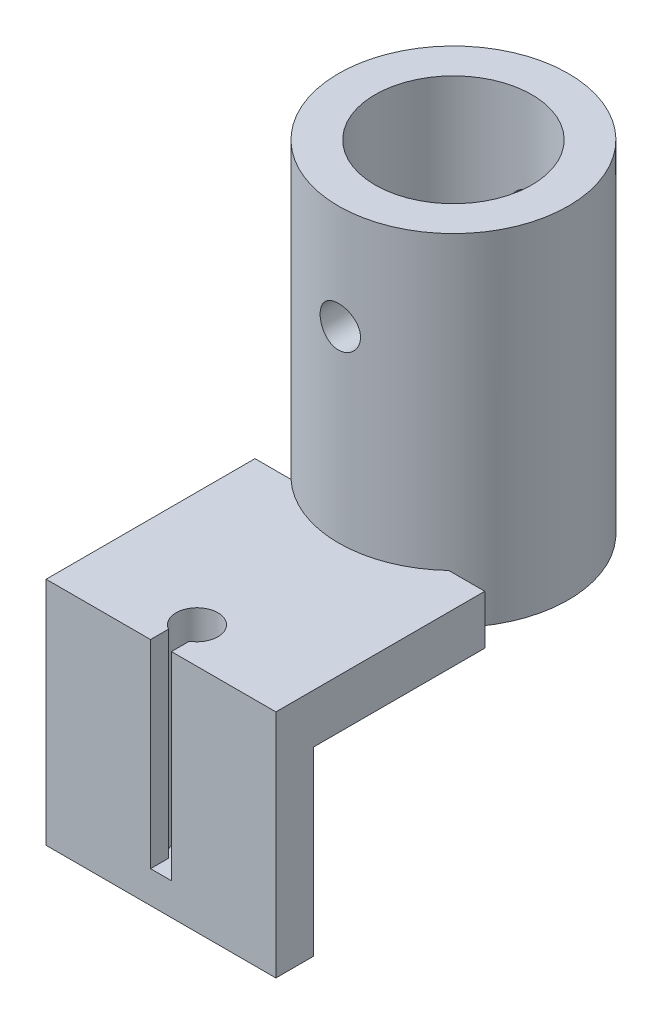
ISO-10303-21;
HEADER;
FILE_DESCRIPTION(('STEP AP214'),'2;1');
FILE_NAME('part.step','',(''),(''),'','','');
FILE_SCHEMA(('AUTOMOTIVE_DESIGN { 1 0 10303 214 1 1 1 1 }'));
ENDSEC;
DATA;
#1=APPLICATION_CONTEXT('core data for automotive mechanical design processes');
#2=APPLICATION_PROTOCOL_DEFINITION('international standard','automotive_design',2000,#1);
#3=PRODUCT_CONTEXT('',#1,'mechanical');
#4=PRODUCT('Part','Part','',(#3));
#5=PRODUCT_RELATED_PRODUCT_CATEGORY('part','',(#4));
#6=PRODUCT_DEFINITION_FORMATION('','',#4);
#7=PRODUCT_DEFINITION_CONTEXT('part definition',#1,'design');
#8=PRODUCT_DEFINITION('design','',#6,#7);
#9=PRODUCT_DEFINITION_SHAPE('','',#8);
#10=(LENGTH_UNIT() NAMED_UNIT(*) SI_UNIT(.MILLI.,.METRE.));
#11=(NAMED_UNIT(*) PLANE_ANGLE_UNIT() SI_UNIT($,.RADIAN.));
#12=(NAMED_UNIT(*) SI_UNIT($,.STERADIAN.) SOLID_ANGLE_UNIT());
#13=UNCERTAINTY_MEASURE_WITH_UNIT(LENGTH_MEASURE(1.E-05),#10,'distance_accuracy_value','');
#14=(GEOMETRIC_REPRESENTATION_CONTEXT(3) GLOBAL_UNCERTAINTY_ASSIGNED_CONTEXT((#13)) GLOBAL_UNIT_ASSIGNED_CONTEXT((#10,
#11,#12)) REPRESENTATION_CONTEXT('',''));
#15=CARTESIAN_POINT('',(0.,0.,0.));
#16=DIRECTION('',(0.,0.,1.));
#17=DIRECTION('',(1.,0.,0.));
#18=AXIS2_PLACEMENT_3D('',#15,#16,#17);
#19=CARTESIAN_POINT('',(0.,50.,0.));
#20=DIRECTION('',(0.,-1.,0.));
#21=DIRECTION('',(0.,0.,-1.));
#22=AXIS2_PLACEMENT_3D('',#19,#20,#21);
#23=CYLINDRICAL_SURFACE('',#22,11.);
#24=CARTESIAN_POINT('',(0.,41.935,-11.));
#25=CARTESIAN_POINT('',(-0.107798300732466,41.9349957604423,-10.9999980996234));
#26=CARTESIAN_POINT('',(-0.215653190352968,41.9259614447859,-10.9983989460169));
#27=CARTESIAN_POINT('',(-0.428331828274748,41.8900814433527,-10.9921736555933));
#28=CARTESIAN_POINT('',(-0.533152801481266,41.8632199570773,-10.987544833584));
#29=CARTESIAN_POINT('',(-0.736656342304242,41.7925268546714,-10.9757787933153));
#30=CARTESIAN_POINT('',(-0.835344073440022,41.7487097442508,-10.96864371966));
#31=CARTESIAN_POINT('',(-1.02395593211921,41.6453885879771,-10.9526473802527));
#32=CARTESIAN_POINT('',(-1.11388093398723,41.5858861093729,-10.9437862869841));
#33=CARTESIAN_POINT('',(-1.28337904046798,41.4522129081652,-10.9252133580473));
#34=CARTESIAN_POINT('',(-1.36284578997306,41.3779083236972,-10.9154942459053));
#35=CARTESIAN_POINT('',(-1.50825231814859,41.21702821766,-10.8963556449968));
#36=CARTESIAN_POINT('',(-1.57419119394373,41.1304518777029,-10.8869361762643));
#37=CARTESIAN_POINT('',(-1.69110342781324,40.9467461317815,-10.8693928195898));
#38=CARTESIAN_POINT('',(-1.74197030891694,40.8495479870297,-10.8612783264002));
#39=CARTESIAN_POINT('',(-1.82661342355483,40.6478197516009,-10.8473653474859));
#40=CARTESIAN_POINT('',(-1.86039094751275,40.543290215199,-10.8415666868987));
#41=CARTESIAN_POINT('',(-1.90955872088715,40.3309984978618,-10.8330147262082));
#42=CARTESIAN_POINT('',(-1.92513340824958,40.2232802870632,-10.8302309002416));
#43=CARTESIAN_POINT('',(-1.93802552688535,40.0067263262623,-10.8279316043739));
#44=CARTESIAN_POINT('',(-1.93534439770384,39.8978906650514,-10.82841587677));
#45=CARTESIAN_POINT('',(-1.91195092983359,39.6835162353439,-10.8325702229002));
#46=CARTESIAN_POINT('',(-1.89144686334163,39.5779539216925,-10.8362034971524));
#47=CARTESIAN_POINT('',(-1.83331689917424,39.3717913884573,-10.8461887816728));
#48=CARTESIAN_POINT('',(-1.79569035357035,39.2711913568099,-10.8525408948235));
#49=CARTESIAN_POINT('',(-1.70417558000238,39.0771916233636,-10.8672873363215));
#50=CARTESIAN_POINT('',(-1.6502018957683,38.9838330792564,-10.8756923505991));
#51=CARTESIAN_POINT('',(-1.52758552913526,38.8074190667515,-10.8935902992068));
#52=CARTESIAN_POINT('',(-1.45894153134716,38.7243645233009,-10.9030833310567));
#53=CARTESIAN_POINT('',(-1.30780340794176,38.5697114916149,-10.9222488122133));
#54=CARTESIAN_POINT('',(-1.22513082099987,38.4982873764564,-10.9319219268388));
#55=CARTESIAN_POINT('',(-1.04888309423207,38.3702974940319,-10.9502365753995));
#56=CARTESIAN_POINT('',(-0.955307868495456,38.3137318438593,-10.958878101205));
#57=CARTESIAN_POINT('',(-0.759739470105757,38.2170445203206,-10.9741703100929));
#58=CARTESIAN_POINT('',(-0.657737935531648,38.1769394230366,-10.9808189845293));
#59=CARTESIAN_POINT('',(-0.448303463594468,38.1144796591589,-10.9913605256456));
#60=CARTESIAN_POINT('',(-0.34087103410041,38.0921233360464,-10.9952536495013));
#61=CARTESIAN_POINT('',(-0.125126131602164,38.0660348324668,-10.9998105393369));
#62=CARTESIAN_POINT('',(-0.0168434269159108,38.062063474325,-11.0005157750175));
#63=CARTESIAN_POINT('',(0.198839479246955,38.0722182952537,-10.9987314265803));
#64=CARTESIAN_POINT('',(0.306239718496716,38.0863436956045,-10.9962419799325));
#65=CARTESIAN_POINT('',(0.516361680017287,38.1320921501891,-10.9883737169537));
#66=CARTESIAN_POINT('',(0.619110231632479,38.1635956682617,-10.9830146467512));
#67=CARTESIAN_POINT('',(0.817867386070802,38.2430778330117,-10.9700055402181));
#68=CARTESIAN_POINT('',(0.913875574961641,38.2910574904409,-10.9623553633402));
#69=CARTESIAN_POINT('',(1.09745781955809,38.402669824816,-10.9455094112871));
#70=CARTESIAN_POINT('',(1.18494054974232,38.4664505090025,-10.9362992983878));
#71=CARTESIAN_POINT('',(1.34804686850675,38.6076522372847,-10.9173954634863));
#72=CARTESIAN_POINT('',(1.42366948986564,38.685074392784,-10.9077017021261));
#73=CARTESIAN_POINT('',(1.56180513954747,38.8524384969719,-10.8887875146657));
#74=CARTESIAN_POINT('',(1.62415585191624,38.9425153070373,-10.8795738868835));
#75=CARTESIAN_POINT('',(1.73284091238269,39.1320048243113,-10.8627942623141));
#76=CARTESIAN_POINT('',(1.77917580830503,39.2314172120463,-10.8552282091746));
#77=CARTESIAN_POINT('',(1.85427658379618,39.4363200641377,-10.8426524166645));
#78=CARTESIAN_POINT('',(1.88312050121377,39.5417811983743,-10.8376313393446));
#79=CARTESIAN_POINT('',(1.92266414887922,39.7561481516085,-10.8306866209408));
#80=CARTESIAN_POINT('',(1.93336565573024,39.865053632253,-10.8287626765698));
#81=CARTESIAN_POINT('',(1.93626687128828,40.0815949496814,-10.8282441376828));
#82=CARTESIAN_POINT('',(1.92872228814715,40.1892273347505,-10.8296035288159));
#83=CARTESIAN_POINT('',(1.89590137941687,40.4016650425193,-10.8353971364659));
#84=CARTESIAN_POINT('',(1.87062513100653,40.506470377522,-10.8398313395993));
#85=CARTESIAN_POINT('',(1.80316068873677,40.7101634088313,-10.8512566409745));
#86=CARTESIAN_POINT('',(1.76099695964016,40.8090594287686,-10.8582440391436));
#87=CARTESIAN_POINT('',(1.66098137013199,40.9984151383559,-10.8739915643097));
#88=CARTESIAN_POINT('',(1.6031285877568,41.0888743317978,-10.882751795479));
#89=CARTESIAN_POINT('',(1.47247461621247,41.2600758432618,-10.9012025140866));
#90=CARTESIAN_POINT('',(1.39948615043526,41.3406741027276,-10.9109037564993));
#91=CARTESIAN_POINT('',(1.24102594293576,41.4885653507267,-10.9300599557264));
#92=CARTESIAN_POINT('',(1.15555133204841,41.5558552727771,-10.9395148553442));
#93=CARTESIAN_POINT('',(0.973750949857101,41.6757035683908,-10.9571988746708));
#94=CARTESIAN_POINT('',(0.877345868203405,41.7281431548607,-10.9654178765861));
#95=CARTESIAN_POINT('',(0.676985586704339,41.8160004318573,-10.9796055640486));
#96=CARTESIAN_POINT('',(0.573037837468801,41.8514346636333,-10.9855764351479));
#97=CARTESIAN_POINT('',(0.390605747327076,41.8967961789258,-10.9933286777153));
#98=CARTESIAN_POINT('',(0.313209862898434,41.9110990153308,-10.9958167297828));
#99=CARTESIAN_POINT('',(0.157219337263767,41.9302023745171,-10.9991530671462));
#100=CARTESIAN_POINT('',(0.0786247206788862,41.9350030922012,-11.0000013860755));
#101=CARTESIAN_POINT('',(0.,41.935,-11.));
#102=B_SPLINE_CURVE_WITH_KNOTS('',3,(#24,#25,#26,#27,#28,#29,#30,#31,#32,#33,#34,#35,#36,#37,
#38,#39,#40,#41,#42,#43,#44,#45,#46,#47,#48,#49,#50,#51,#52,#53,#54,#55,#56,#57,#58,#59,#60,#61,
#62,#63,#64,#65,#66,#67,#68,#69,#70,#71,#72,#73,#74,#75,#76,#77,#78,#79,#80,#81,#82,#83,#84,#85,
#86,#87,#88,#89,#90,#91,#92,#93,#94,#95,#96,#97,#98,#99,#100,#101),.UNSPECIFIED.,.T.,.F.,(4,2,2,
2,2,2,2,2,2,2,2,2,2,2,2,2,2,2,2,2,2,2,2,2,2,2,2,2,2,2,2,2,2,2,2,2,2,2,4),(0.,0.323107447197429,
0.646501652681637,0.969619800605967,1.29270567547517,1.61885808937813,1.94503226421979,
2.27345859304107,2.60186011856532,2.92690448959888,3.251923229863,3.57319421807926,
3.89447736446079,4.2174699203214,4.54049144892878,4.86798154151709,5.1954742148394,
5.52329587495172,5.85108693539623,6.17460141356272,6.49810197107546,6.81940457263364,
7.14072688847164,7.46518103509412,7.78966162801418,8.11790769974874,8.44614254263986,
8.77290194469031,9.09962934684071,9.42180445491817,9.74397816070528,10.0656868144076,
10.3874143773437,10.7133896528243,11.0394399516508,11.3680290438382,11.6962978635946,
11.9319671989006,12.1676317002197),.UNSPECIFIED.);
#103=CARTESIAN_POINT('',(0.,41.935,-11.));
#104=VERTEX_POINT('',#103);
#105=EDGE_CURVE('E231',#104,#104,#102,.T.);
#106=ORIENTED_EDGE('',*,*,#105,.T.);
#107=EDGE_LOOP('',(#106));
#108=FACE_BOUND('',#107,.T.);
#109=CARTESIAN_POINT('',(1.935,40.,10.8284705752936));
#110=CARTESIAN_POINT('',(1.93499574853755,39.8922162451031,10.8284725893971));
#111=CARTESIAN_POINT('',(1.92596378846799,39.7843758666896,10.8300973078839));
#112=CARTESIAN_POINT('',(1.89009399182154,39.5717273666734,10.8364137863099));
#113=CARTESIAN_POINT('',(1.86324030050737,39.4669220318571,10.8411082771543));
#114=CARTESIAN_POINT('',(1.79256999084182,39.2634515950013,10.853016529543));
#115=CARTESIAN_POINT('',(1.74876824557947,39.164781197009,10.8602280816501));
#116=CARTESIAN_POINT('',(1.64548329887357,38.9761985092646,10.876355285038));
#117=CARTESIAN_POINT('',(1.58600162849069,38.8862853655868,10.8852707699158));
#118=CARTESIAN_POINT('',(1.45234966973699,38.7167744004669,10.9039105266286));
#119=CARTESIAN_POINT('',(1.3780408525079,38.637286566215,10.9136418820687));
#120=CARTESIAN_POINT('',(1.21714335843051,38.4918391921289,10.9327541345797));
#121=CARTESIAN_POINT('',(1.13055392139233,38.4258804903883,10.9421350099098));
#122=CARTESIAN_POINT('',(0.946836173898078,38.308947095553,10.9595647093219));
#123=CARTESIAN_POINT('',(0.849641377666937,38.2580753542068,10.9676042244816));
#124=CARTESIAN_POINT('',(0.647920399116483,38.1734223373944,10.9813663374638));
#125=CARTESIAN_POINT('',(0.543394748042319,38.1396398249769,10.9870891029712));
#126=CARTESIAN_POINT('',(0.331117087773755,38.0904622569949,10.995522897195));
#127=CARTESIAN_POINT('',(0.223409180014938,38.0748821160419,10.9982642216657));
#128=CARTESIAN_POINT('',(0.00687555250102919,38.061975517667,11.0005304940157));
#129=CARTESIAN_POINT('',(-0.101950082397506,38.0646476846305,11.0000556842841));
#130=CARTESIAN_POINT('',(-0.316362888467173,38.0880265364185,10.9959670364676));
#131=CARTESIAN_POINT('',(-0.421972539379184,38.1085339902991,10.9923878770401));
#132=CARTESIAN_POINT('',(-0.628227980064162,38.1666869734296,10.9825314372781));
#133=CARTESIAN_POINT('',(-0.728873605359216,38.2043330701285,10.976254067608));
#134=CARTESIAN_POINT('',(-0.922930251180134,38.295889177031,10.9616479369522));
#135=CARTESIAN_POINT('',(-1.01630224054765,38.3498802245606,10.9533089934714));
#136=CARTESIAN_POINT('',(-1.19273586799729,38.4725341140617,10.935504374105));
#137=CARTESIAN_POINT('',(-1.27579657812861,38.5411982750108,10.9260385969615));
#138=CARTESIAN_POINT('',(-1.43042844581992,38.6923512567167,10.9068802994464));
#139=CARTESIAN_POINT('',(-1.50182924908665,38.7750142900563,10.8971864434054));
#140=CARTESIAN_POINT('',(-1.62977657086292,38.9512344068196,10.8787875875423));
#141=CARTESIAN_POINT('',(-1.68632292028936,39.0447916142304,10.8700825989767));
#142=CARTESIAN_POINT('',(-1.78299610574292,39.2403540149316,10.8546458350599));
#143=CARTESIAN_POINT('',(-1.82310061341606,39.3423704716483,10.8479167465148));
#144=CARTESIAN_POINT('',(-1.88555467891446,39.5518375392301,10.8372366065611));
#145=CARTESIAN_POINT('',(-1.90790599076062,39.6592876121364,10.8332852807134));
#146=CARTESIAN_POINT('',(-1.93397552796256,39.8750424512423,10.8286616854474));
#147=CARTESIAN_POINT('',(-1.93793741192634,39.9833168859175,10.8279465400777));
#148=CARTESIAN_POINT('',(-1.92776659552939,40.198981020864,10.8297618465244));
#149=CARTESIAN_POINT('',(-1.91363467759461,40.3063707591897,10.8322921579983));
#150=CARTESIAN_POINT('',(-1.86788577941721,40.5164315257679,10.840273522505));
#151=CARTESIAN_POINT('',(-1.83639441348221,40.6191307800221,10.8457035840023));
#152=CARTESIAN_POINT('',(-1.75695294380663,40.8177946773773,10.8588548031925));
#153=CARTESIAN_POINT('',(-1.70900175579265,40.9137588763121,10.8665761118144));
#154=CARTESIAN_POINT('',(-1.59743288225755,41.0973082984876,10.8835386021612));
#155=CARTESIAN_POINT('',(-1.53366000668246,41.1847978041181,10.8927945185677));
#156=CARTESIAN_POINT('',(-1.39246942548561,41.347921395965,10.9117409396742));
#157=CARTESIAN_POINT('',(-1.31505064605038,41.4235545483043,10.9214314785303));
#158=CARTESIAN_POINT('',(-1.14768259349554,41.5617170532962,10.9402918209418));
#159=CARTESIAN_POINT('',(-1.05759772738292,41.6240833149374,10.9494542343387));
#160=CARTESIAN_POINT('',(-0.868087556160912,41.7327956207474,10.9661049917731));
#161=CARTESIAN_POINT('',(-0.768662579122865,41.7791422273392,10.973593394579));
#162=CARTESIAN_POINT('',(-0.56376438203063,41.854249944736,10.9860204163005));
#163=CARTESIAN_POINT('',(-0.458322376321753,41.8830941337412,10.9909710634299));
#164=CARTESIAN_POINT('',(-0.243996097068897,41.9226447908804,10.9978158236253));
#165=CARTESIAN_POINT('',(-0.135112141465561,41.9333529293238,10.9997102181678));
#166=CARTESIAN_POINT('',(0.08143749398107,41.9362751088781,11.0002243524477));
#167=CARTESIAN_POINT('',(0.189099811305215,41.9287364996503,10.998887889417));
#168=CARTESIAN_POINT('',(0.401598959322069,41.8959170745163,10.9931805663424));
#169=CARTESIAN_POINT('',(0.506435810419884,41.8706363867765,10.9888097282185));
#170=CARTESIAN_POINT('',(0.710197969703897,41.8031494347866,10.9775236535447));
#171=CARTESIAN_POINT('',(0.809131209409462,41.7609664950959,10.9706119244224));
#172=CARTESIAN_POINT('',(0.998553458520875,41.6609008520625,10.9549958470054));
#173=CARTESIAN_POINT('',(1.08904199468149,41.6030172695576,10.9462913983335));
#174=CARTESIAN_POINT('',(1.2602465974113,41.4723274196824,10.9279136060408));
#175=CARTESIAN_POINT('',(1.34082401316346,41.3993410309346,10.9182293647678));
#176=CARTESIAN_POINT('',(1.48867417029126,41.2408938128045,10.8990559850883));
#177=CARTESIAN_POINT('',(1.55594378842538,41.1554300632383,10.8895668929488));
#178=CARTESIAN_POINT('',(1.67576779146767,40.9736404040531,10.8717759120457));
#179=CARTESIAN_POINT('',(1.72820033576775,40.8772331789932,10.8634841123962));
#180=CARTESIAN_POINT('',(1.81604387056572,40.676868825736,10.849146611922));
#181=CARTESIAN_POINT('',(1.85147146539472,40.5729191769416,10.8430987213679));
#182=CARTESIAN_POINT('',(1.89681613352542,40.3905043690584,10.8352408787082));
#183=CARTESIAN_POINT('',(1.91111144745289,40.3131287988889,10.8327165385563));
#184=CARTESIAN_POINT('',(1.93020482756559,40.1571788401004,10.8293306705265));
#185=CARTESIAN_POINT('',(1.9350031005042,40.0786044776169,10.8284691064494));
#186=CARTESIAN_POINT('',(1.935,40.,10.8284705752936));
#187=B_SPLINE_CURVE_WITH_KNOTS('',3,(#109,#110,#111,#112,#113,#114,#115,#116,#117,#118,#119,
#120,#121,#122,#123,#124,#125,#126,#127,#128,#129,#130,#131,#132,#133,#134,#135,#136,#137,#138,
#139,#140,#141,#142,#143,#144,#145,#146,#147,#148,#149,#150,#151,#152,#153,#154,#155,#156,#157,
#158,#159,#160,#161,#162,#163,#164,#165,#166,#167,#168,#169,#170,#171,#172,#173,#174,#175,#176,
#177,#178,#179,#180,#181,#182,#183,#184,#185,#186),.UNSPECIFIED.,.T.,.F.,(4,2,2,2,2,2,2,2,2,2,2,
2,2,2,2,2,2,2,2,2,2,2,2,2,2,2,2,2,2,2,2,2,2,2,2,2,2,2,4),(0.,0.323063733987833,
0.646415260951128,0.969483665840715,1.29252053650896,1.61873016898046,1.94496000316714,
2.27336731168046,2.6017508460385,2.92676541986307,3.25175549870991,3.57316120437233,
3.89457755233975,4.21761431367595,4.5406801252634,4.8681098547002,5.19554331099464,
5.5234199672779,5.85126422522148,6.17475192969743,6.49822564614437,6.81938883624284,
7.14057318668844,7.4650419411336,7.78953623984442,8.11781453399066,8.4460813016719,
8.77277745141208,9.09944351117486,9.42170620199971,9.74396656486632,10.0657837420784,
10.3876189432631,10.713539999894,11.0395374572735,11.3681390437766,11.6964191141586,
11.9320279861073,12.167631728725),.UNSPECIFIED.);
#188=CARTESIAN_POINT('',(1.935,40.,10.8284705752936));
#189=VERTEX_POINT('',#188);
#190=EDGE_CURVE('E225',#189,#189,#187,.T.);
#191=ORIENTED_EDGE('',*,*,#190,.T.);
#192=EDGE_LOOP('',(#191));
#193=FACE_BOUND('',#192,.T.);
#194=CARTESIAN_POINT('',(0.,50.,0.));
#195=DIRECTION('',(0.,1.,0.));
#196=DIRECTION('',(0.,0.,1.));
#197=AXIS2_PLACEMENT_3D('',#194,#195,#196);
#198=CIRCLE('',#197,11.);
#199=CARTESIAN_POINT('',(0.,50.,11.));
#200=VERTEX_POINT('',#199);
#201=EDGE_CURVE('E264',#200,#200,#198,.T.);
#202=ORIENTED_EDGE('',*,*,#201,.F.);
#203=EDGE_LOOP('',(#202));
#204=FACE_BOUND('',#203,.T.);
#205=CARTESIAN_POINT('',(0.,17.34495688039,0.));
#206=DIRECTION('',(0.,1.,0.));
#207=DIRECTION('',(0.,0.,1.));
#208=AXIS2_PLACEMENT_3D('',#205,#206,#207);
#209=CIRCLE('',#208,11.);
#210=CARTESIAN_POINT('',(7.54983443527075,17.34495688039,8.));
#211=VERTEX_POINT('',#210);
#212=CARTESIAN_POINT('',(-7.54983443527075,17.34495688039,8.));
#213=VERTEX_POINT('',#212);
#214=EDGE_CURVE('E155',#211,#213,#209,.T.);
#215=ORIENTED_EDGE('',*,*,#214,.T.);
#216=DIRECTION('',(0.,-1.,0.));
#217=VECTOR('',#216,1.);
#218=CARTESIAN_POINT('',(-7.54983443527075,50.,8.));
#219=LINE('',#218,#217);
#220=CARTESIAN_POINT('',(-7.54983443527075,22.065,8.));
#221=VERTEX_POINT('',#220);
#222=EDGE_CURVE('E215',#213,#221,#219,.F.);
#223=ORIENTED_EDGE('',*,*,#222,.T.);
#224=CARTESIAN_POINT('',(0.,22.065,0.));
#225=DIRECTION('',(0.,1.,0.));
#226=DIRECTION('',(0.,0.,1.));
#227=AXIS2_PLACEMENT_3D('',#224,#225,#226);
#228=CIRCLE('',#227,11.);
#229=CARTESIAN_POINT('',(7.54983443527075,22.065,8.));
#230=VERTEX_POINT('',#229);
#231=EDGE_CURVE('E260',#221,#230,#228,.T.);
#232=ORIENTED_EDGE('',*,*,#231,.T.);
#233=DIRECTION('',(0.,-1.,0.));
#234=VECTOR('',#233,1.);
#235=CARTESIAN_POINT('',(7.54983443527075,50.,8.));
#236=LINE('',#235,#234);
#237=EDGE_CURVE('E221',#230,#211,#236,.T.);
#238=ORIENTED_EDGE('',*,*,#237,.T.);
#239=EDGE_LOOP('',(#215,#223,#232,#238));
#240=FACE_BOUND('',#239,.T.);
#241=ADVANCED_FACE('F33',(#108,#193,#204,#240),#23,.T.);
#242=CARTESIAN_POINT('',(0.,50.,0.));
#243=DIRECTION('',(0.,1.,0.));
#244=DIRECTION('',(0.,0.,1.));
#245=AXIS2_PLACEMENT_3D('',#242,#243,#244);
#246=PLANE('',#245);
#247=CARTESIAN_POINT('',(0.,50.,0.));
#248=DIRECTION('',(0.,1.,0.));
#249=DIRECTION('',(0.,0.,1.));
#250=AXIS2_PLACEMENT_3D('',#247,#248,#249);
#251=CIRCLE('',#250,7.5);
#252=CARTESIAN_POINT('',(0.,50.,7.5));
#253=VERTEX_POINT('',#252);
#254=EDGE_CURVE('E344',#253,#253,#251,.T.);
#255=ORIENTED_EDGE('',*,*,#254,.F.);
#256=EDGE_LOOP('',(#255));
#257=FACE_BOUND('',#256,.T.);
#258=ORIENTED_EDGE('',*,*,#201,.T.);
#259=EDGE_LOOP('',(#258));
#260=FACE_BOUND('',#259,.T.);
#261=ADVANCED_FACE('F330',(#257,#260),#246,.T.);
#262=CARTESIAN_POINT('',(0.,0.,0.));
#263=DIRECTION('',(0.,1.,0.));
#264=DIRECTION('',(0.,0.,1.));
#265=AXIS2_PLACEMENT_3D('',#262,#263,#264);
#266=PLANE('',#265);
#267=DIRECTION('',(0.,0.,1.));
#268=VECTOR('',#267,1.);
#269=CARTESIAN_POINT('',(-11.,0.,8.));
#270=LINE('',#269,#268);
#271=CARTESIAN_POINT('',(-11.,0.,24.4134393915047));
#272=VERTEX_POINT('',#271);
#273=CARTESIAN_POINT('',(-11.,0.,28.));
#274=VERTEX_POINT('',#273);
#275=EDGE_CURVE('E211',#272,#274,#270,.T.);
#276=ORIENTED_EDGE('',*,*,#275,.F.);
#277=DIRECTION('',(1.,0.,0.));
#278=VECTOR('',#277,1.);
#279=CARTESIAN_POINT('',(0.,0.,24.4134393915047));
#280=LINE('',#279,#278);
#281=CARTESIAN_POINT('',(11.,0.,24.4134393915047));
#282=VERTEX_POINT('',#281);
#283=EDGE_CURVE('E165',#272,#282,#280,.T.);
#284=ORIENTED_EDGE('',*,*,#283,.T.);
#285=DIRECTION('',(0.,0.,1.));
#286=VECTOR('',#285,1.);
#287=CARTESIAN_POINT('',(11.,0.,8.));
#288=LINE('',#287,#286);
#289=CARTESIAN_POINT('',(11.,0.,28.));
#290=VERTEX_POINT('',#289);
#291=EDGE_CURVE('E147',#282,#290,#288,.T.);
#292=ORIENTED_EDGE('',*,*,#291,.T.);
#293=DIRECTION('',(1.,0.,0.));
#294=VECTOR('',#293,1.);
#295=CARTESIAN_POINT('',(11.,0.,28.));
#296=LINE('',#295,#294);
#297=EDGE_CURVE('E192',#274,#290,#296,.T.);
#298=ORIENTED_EDGE('',*,*,#297,.F.);
#299=EDGE_LOOP('',(#276,#284,#292,#298));
#300=FACE_BOUND('',#299,.T.);
#301=ADVANCED_FACE('F316',(#300),#266,.F.);
#302=CARTESIAN_POINT('',(0.,0.,0.));
#303=DIRECTION('',(0.,1.,0.));
#304=DIRECTION('',(0.,0.,1.));
#305=AXIS2_PLACEMENT_3D('',#302,#303,#304);
#306=CYLINDRICAL_SURFACE('',#305,7.5);
#307=CARTESIAN_POINT('',(0.,17.34495688039,0.));
#308=DIRECTION('',(0.,1.,0.));
#309=DIRECTION('',(0.,0.,1.));
#310=AXIS2_PLACEMENT_3D('',#307,#308,#309);
#311=CIRCLE('',#310,7.5);
#312=CARTESIAN_POINT('',(0.,17.34495688039,7.5));
#313=VERTEX_POINT('',#312);
#314=EDGE_CURVE('E158',#313,#313,#311,.F.);
#315=ORIENTED_EDGE('',*,*,#314,.T.);
#316=EDGE_LOOP('',(#315));
#317=FACE_BOUND('',#316,.T.);
#318=CARTESIAN_POINT('',(0.,38.065,7.5));
#319=CARTESIAN_POINT('',(0.106797237980942,38.0650027866041,7.49999827753044));
#320=CARTESIAN_POINT('',(0.213624985265451,38.0738712869985,7.49769627387667));
#321=CARTESIAN_POINT('',(0.424211351923698,38.1090532856317,7.48873641802475));
#322=CARTESIAN_POINT('',(0.527968326082703,38.1353759645923,7.48207627351277));
#323=CARTESIAN_POINT('',(0.729342304167862,38.2045598288629,7.46513650944404));
#324=CARTESIAN_POINT('',(0.826966764737471,38.2474004585645,7.45486138989458));
#325=CARTESIAN_POINT('',(1.01364419072762,38.3483299705762,7.4317819964575));
#326=CARTESIAN_POINT('',(1.10269673188584,38.4064196070975,7.41897759748024));
#327=CARTESIAN_POINT('',(1.27164595410486,38.5375370199307,7.39191366269842));
#328=CARTESIAN_POINT('',(1.35132890210553,38.6108353359182,7.37763052004198));
#329=CARTESIAN_POINT('',(1.49741829768282,38.7697106384958,7.34937322807968));
#330=CARTESIAN_POINT('',(1.56382314929492,38.8552890989806,7.33539911609716));
#331=CARTESIAN_POINT('',(1.682493969367,39.0379769299804,7.30910246240488));
#332=CARTESIAN_POINT('',(1.73451764186757,39.1352483860722,7.29680980373955));
#333=CARTESIAN_POINT('',(1.82139001670731,39.3375251325166,7.27561349297241));
#334=CARTESIAN_POINT('',(1.85624166232676,39.4425290939712,7.26670926015501));
#335=CARTESIAN_POINT('',(1.90704531320303,39.6549318988084,7.25354112214285));
#336=CARTESIAN_POINT('',(1.92338314801486,39.7622324548243,7.24918264306365));
#337=CARTESIAN_POINT('',(1.93789772553221,39.9781331540935,7.24531665887671));
#338=CARTESIAN_POINT('',(1.93607762850987,40.0867330679157,7.24580830963466));
#339=CARTESIAN_POINT('',(1.91463512178359,40.2991671317297,7.2515021937783));
#340=CARTESIAN_POINT('',(1.89547580387018,40.403051826889,7.25658188395652));
#341=CARTESIAN_POINT('',(1.8406388527732,40.6060801133457,7.27068376704329));
#342=CARTESIAN_POINT('',(1.80495997488177,40.7052233467645,7.27970625702913));
#343=CARTESIAN_POINT('',(1.71771026226252,40.8971797520056,7.30078736963518));
#344=CARTESIAN_POINT('',(1.66597407111552,40.9899141777475,7.31287733263246));
#345=CARTESIAN_POINT('',(1.54819383832336,41.1655497285931,7.33871386593056));
#346=CARTESIAN_POINT('',(1.48214714419809,41.248449026322,7.35246074313385));
#347=CARTESIAN_POINT('',(1.3352365757102,41.4047111985414,7.38057537486749));
#348=CARTESIAN_POINT('',(1.25398280232459,41.4777068859194,7.39494928988412));
#349=CARTESIAN_POINT('',(1.08021332511655,41.6091083723438,7.42232199870712));
#350=CARTESIAN_POINT('',(0.987697231967451,41.6675136668022,7.43532074494629));
#351=CARTESIAN_POINT('',(0.79348430014447,41.7682238815366,7.45855022247645));
#352=CARTESIAN_POINT('',(0.691753486209102,41.81046594827,7.46877010399517));
#353=CARTESIAN_POINT('',(0.482311360627632,41.8771446246891,7.48521169832409));
#354=CARTESIAN_POINT('',(0.37460127450731,41.9015848686833,7.4914342271781));
#355=CARTESIAN_POINT('',(0.159394761691713,41.931397923828,7.49905799092621));
#356=CARTESIAN_POINT('',(0.0519719230296768,41.9372703794175,7.50058553190108));
#357=CARTESIAN_POINT('',(-0.162322541949958,41.9311560114195,7.49900855398848));
#358=CARTESIAN_POINT('',(-0.269194220346652,41.9191709074091,7.49590448109792));
#359=CARTESIAN_POINT('',(-0.477594189710328,41.8780925620636,7.48549430327971));
#360=CARTESIAN_POINT('',(-0.579180468493374,41.8492747859352,7.47825589766758));
#361=CARTESIAN_POINT('',(-0.776069519075939,41.7756662441903,7.46039522868072));
#362=CARTESIAN_POINT('',(-0.871371632151986,41.7308738072097,7.44977261124205));
#363=CARTESIAN_POINT('',(-1.05495307138853,41.6256388146322,7.42602237183994));
#364=CARTESIAN_POINT('',(-1.14306845648893,41.564920204902,7.41285176264739));
#365=CARTESIAN_POINT('',(-1.30803595733531,41.429906526982,7.3855294717554));
#366=CARTESIAN_POINT('',(-1.3848859915781,41.3556089554859,7.37137760945921));
#367=CARTESIAN_POINT('',(-1.52722241851429,41.1932206388303,7.34322835503841));
#368=CARTESIAN_POINT('',(-1.59235731570364,41.1048188608842,7.32924478358042));
#369=CARTESIAN_POINT('',(-1.70687133145588,40.9180479992832,7.30342723279713));
#370=CARTESIAN_POINT('',(-1.75625113464513,40.8196793489765,7.29159316007652));
#371=CARTESIAN_POINT('',(-1.83748229784448,40.6162804281956,7.27154798250107));
#372=CARTESIAN_POINT('',(-1.86943688157303,40.5112935903476,7.26331560065668));
#373=CARTESIAN_POINT('',(-1.91517052070486,40.2971906788723,7.25139234886506));
#374=CARTESIAN_POINT('',(-1.92895386318593,40.1880755854614,7.24770040772125));
#375=CARTESIAN_POINT('',(-1.93771893545041,39.9724004676903,7.24536143825446));
#376=CARTESIAN_POINT('',(-1.93326390954601,39.8658646179749,7.24656327223757));
#377=CARTESIAN_POINT('',(-1.90697603242405,39.6551184844763,7.25352490785594));
#378=CARTESIAN_POINT('',(-1.88514357547916,39.5509081479852,7.25928460607882));
#379=CARTESIAN_POINT('',(-1.82503729750969,39.3484291634409,7.2746260197283));
#380=CARTESIAN_POINT('',(-1.78687560213936,39.2501251159768,7.28418163876276));
#381=CARTESIAN_POINT('',(-1.6952819079712,39.0612425747335,7.30604039800807));
#382=CARTESIAN_POINT('',(-1.64184765737253,38.9706652227451,7.31834394331742));
#383=CARTESIAN_POINT('',(-1.51948769094102,38.7971010984101,7.34473762685807));
#384=CARTESIAN_POINT('',(-1.4501741908664,38.7143937525012,7.35886778424153));
#385=CARTESIAN_POINT('',(-1.29877038953271,38.5616011639977,7.3870911092543));
#386=CARTESIAN_POINT('',(-1.21667702641004,38.4915189548993,7.40118426719415));
#387=CARTESIAN_POINT('',(-1.04009839654822,38.3646189098781,7.4280762440431));
#388=CARTESIAN_POINT('',(-0.945401458825964,38.3080885488563,7.44084421408099));
#389=CARTESIAN_POINT('',(-0.747524790654888,38.211839507394,7.4633163045272));
#390=CARTESIAN_POINT('',(-0.644350898642338,38.172109369948,7.47302251177042));
#391=CARTESIAN_POINT('',(-0.451210527393178,38.1161498805291,7.48692696366465));
#392=CARTESIAN_POINT('',(-0.362123973227896,38.0970115759082,7.49179471828687));
#393=CARTESIAN_POINT('',(-0.182032223973633,38.0714359928549,7.49833183333084));
#394=CARTESIAN_POINT('',(-0.0910271941507128,38.0649976248754,7.50000146812383));
#395=CARTESIAN_POINT('',(0.,38.065,7.5));
#396=B_SPLINE_CURVE_WITH_KNOTS('',3,(#318,#319,#320,#321,#322,#323,#324,#325,#326,#327,#328,
#329,#330,#331,#332,#333,#334,#335,#336,#337,#338,#339,#340,#341,#342,#343,#344,#345,#346,#347,
#348,#349,#350,#351,#352,#353,#354,#355,#356,#357,#358,#359,#360,#361,#362,#363,#364,#365,#366,
#367,#368,#369,#370,#371,#372,#373,#374,#375,#376,#377,#378,#379,#380,#381,#382,#383,#384,#385,
#386,#387,#388,#389,#390,#391,#392,#393,#394,#395),.UNSPECIFIED.,.T.,.F.,(4,2,2,2,2,2,2,2,2,2,2,
2,2,2,2,2,2,2,2,2,2,2,2,2,2,2,2,2,2,2,2,2,2,2,2,2,2,2,4),(0.,0.320058020632128,
0.640284522236368,0.960113800514298,1.27995890043142,1.60607467839967,1.93222963041484,
2.263584491094,2.59488253787505,2.91914145417912,3.24334393627304,3.559135245784,
3.87495035325947,4.19413210300335,4.51337306440431,4.84233356885451,5.17130544835764,
5.50154389721729,5.83171490775466,6.15292216449937,6.47409849288833,6.79016048067539,
7.1062555464515,7.42824034151337,7.75028455504165,8.08078756190602,8.41127620504197,
8.73978521933102,9.06821671575241,9.38658319030134,9.70494244171001,10.0211498824194,
10.3374039691419,10.662409972261,10.9874939621252,11.3189611773435,11.6502019806801,
11.9230225508258,12.1958197142578),.UNSPECIFIED.);
#397=CARTESIAN_POINT('',(0.,38.065,7.5));
#398=VERTEX_POINT('',#397);
#399=EDGE_CURVE('E232',#398,#398,#396,.T.);
#400=ORIENTED_EDGE('',*,*,#399,.T.);
#401=EDGE_LOOP('',(#400));
#402=FACE_BOUND('',#401,.T.);
#403=CARTESIAN_POINT('',(1.935,40.,-7.24608687499674));
#404=CARTESIAN_POINT('',(1.93499717639665,39.8932694775152,-7.24608883513091));
#405=CARTESIAN_POINT('',(1.92613937135368,39.7865083707244,-7.24847075448196));
#406=CARTESIAN_POINT('',(1.8910036987853,39.5760602257888,-7.25771478031131));
#407=CARTESIAN_POINT('',(1.86471635762064,39.4723748914854,-7.26457932324135));
#408=CARTESIAN_POINT('',(1.79563575276686,39.2711528855191,-7.28196055591799));
#409=CARTESIAN_POINT('',(1.7528646919394,39.1736081474658,-7.29247233110859));
#410=CARTESIAN_POINT('',(1.65209932153402,38.9870658706879,-7.31595742938945));
#411=CARTESIAN_POINT('',(1.5941041098761,38.8980688388693,-7.32893089833036));
#412=CARTESIAN_POINT('',(1.46308486569426,38.7290635852391,-7.35621796161816));
#413=CARTESIAN_POINT('',(1.38976902785719,38.6492851738817,-7.37055408926406));
#414=CARTESIAN_POINT('',(1.23081777922174,38.5030096470577,-7.39875614468958));
#415=CARTESIAN_POINT('',(1.14518115992427,38.4365138359613,-7.41262202617946));
#416=CARTESIAN_POINT('',(0.962435820767243,38.3177423103202,-7.43857160013222));
#417=CARTESIAN_POINT('',(0.865174958748849,38.2656936377555,-7.4506256054359));
#418=CARTESIAN_POINT('',(0.662920851418588,38.1787721975153,-7.47133549901215));
#419=CARTESIAN_POINT('',(0.557928826658279,38.1438967252881,-7.47999192231529));
#420=CARTESIAN_POINT('',(0.345589946890852,38.0930513927937,-7.4927719952342));
#421=CARTESIAN_POINT('',(0.238342342423238,38.0766909572795,-7.49698915202));
#422=CARTESIAN_POINT('',(0.0225473563948116,38.0621127816816,-7.50074189529084));
#423=CARTESIAN_POINT('',(-0.0859998183341294,38.0638921919207,-7.50027821711131));
#424=CARTESIAN_POINT('',(-0.298599250496155,38.0852650568496,-7.4947906242197));
#425=CARTESIAN_POINT('',(-0.402697118504099,38.1044367390424,-7.48987468406149));
#426=CARTESIAN_POINT('',(-0.606145098349467,38.1593703615283,-7.47616144390189));
#427=CARTESIAN_POINT('',(-0.705494948256818,38.1951332159304,-7.46736393004218));
#428=CARTESIAN_POINT('',(-0.897721584614785,38.2825667153108,-7.44671323737208));
#429=CARTESIAN_POINT('',(-0.990528155767373,38.3343848100351,-7.43483190844603));
#430=CARTESIAN_POINT('',(-1.16627439967112,38.4523454007184,-7.40929833697522));
#431=CARTESIAN_POINT('',(-1.24921225274491,38.5184905320952,-7.39564576880154));
#432=CARTESIAN_POINT('',(-1.40538326279431,38.6654782532365,-7.36758992825101));
#433=CARTESIAN_POINT('',(-1.4782683583568,38.7466890965916,-7.35317635902613));
#434=CARTESIAN_POINT('',(-1.60946621432046,38.9203310044982,-7.32558023726089));
#435=CARTESIAN_POINT('',(-1.6677781994168,39.0127626656205,-7.31239775023875));
#436=CARTESIAN_POINT('',(-1.7684171307173,39.2069390534266,-7.2887173397525));
#437=CARTESIAN_POINT('',(-1.81065520066072,39.3087318037523,-7.27823444310065));
#438=CARTESIAN_POINT('',(-1.87730764083231,39.5183103612375,-7.26132985953393));
#439=CARTESIAN_POINT('',(-1.90172610879739,39.6260947844328,-7.2549072389768));
#440=CARTESIAN_POINT('',(-1.93145809259938,39.8413562890819,-7.24704776573394));
#441=CARTESIAN_POINT('',(-1.93728840077645,39.94875715051,-7.24547608665803));
#442=CARTESIAN_POINT('',(-1.93109766423525,40.1629981735902,-7.24712855535059));
#443=CARTESIAN_POINT('',(-1.91907838270854,40.2698383895769,-7.25035222943166));
#444=CARTESIAN_POINT('',(-1.87798396562013,40.477972386411,-7.26110248829948));
#445=CARTESIAN_POINT('',(-1.8492143141145,40.5793308500135,-7.26855194459644));
#446=CARTESIAN_POINT('',(-1.77577677454106,40.7757852365477,-7.2868401703174));
#447=CARTESIAN_POINT('',(-1.73110691046674,40.8708803793608,-7.29767936098193));
#448=CARTESIAN_POINT('',(-1.62607068963073,41.054285404369,-7.32180624338853));
#449=CARTESIAN_POINT('',(-1.56539795508351,41.1424136187559,-7.33514006140082));
#450=CARTESIAN_POINT('',(-1.43046204657452,41.307427774431,-7.36264286151711));
#451=CARTESIAN_POINT('',(-1.35619648747588,41.3843117384211,-7.376811989897));
#452=CARTESIAN_POINT('',(-1.19380246468261,41.5267728294066,-7.40484926308714));
#453=CARTESIAN_POINT('',(-1.10535541216863,41.591991081827,-7.41869912137024));
#454=CARTESIAN_POINT('',(-0.918466738624296,41.7066516545495,-7.44414528694588));
#455=CARTESIAN_POINT('',(-0.820025646342415,41.7560948088822,-7.45574171336485));
#456=CARTESIAN_POINT('',(-0.616631951064672,41.8373597494127,-7.47530030280294));
#457=CARTESIAN_POINT('',(-0.51173371838555,41.8693109076679,-7.48328906905821));
#458=CARTESIAN_POINT('',(-0.29782179110361,41.9150674929898,-7.4948489955978));
#459=CARTESIAN_POINT('',(-0.188808950859719,41.928876665975,-7.49842106782268));
#460=CARTESIAN_POINT('',(0.0268752344078012,41.9377351870381,-7.50070514151063));
#461=CARTESIAN_POINT('',(0.133523759487465,41.9333126123378,-7.4995539553973));
#462=CARTESIAN_POINT('',(0.34450412177958,41.9070505664228,-7.49282708782103));
#463=CARTESIAN_POINT('',(0.448836036128192,41.8852116760156,-7.48725155390333));
#464=CARTESIAN_POINT('',(0.651629737847866,41.8250275960457,-7.4723264928502));
#465=CARTESIAN_POINT('',(0.750123320059496,41.7867834308529,-7.46300008534965));
#466=CARTESIAN_POINT('',(0.939351812643972,41.6949652356963,-7.44155203073968));
#467=CARTESIAN_POINT('',(1.03008568893743,41.6413891666833,-7.42943001187274));
#468=CARTESIAN_POINT('',(1.20370186605682,41.5188481947457,-7.40331074550269));
#469=CARTESIAN_POINT('',(1.2863280096719,41.4495288243147,-7.38927387129088));
#470=CARTESIAN_POINT('',(1.43895418346912,41.2981496446994,-7.36107653047144));
#471=CARTESIAN_POINT('',(1.50895095221686,41.2160865547035,-7.34691603292603));
#472=CARTESIAN_POINT('',(1.63572602347117,41.0395533592671,-7.31974714697687));
#473=CARTESIAN_POINT('',(1.69220858331425,40.9448660218714,-7.30676782729729));
#474=CARTESIAN_POINT('',(1.78837068536365,40.7470169453532,-7.28383078719304));
#475=CARTESIAN_POINT('',(1.82806187626929,40.6438611405877,-7.27387097340614));
#476=CARTESIAN_POINT('',(1.88394040299757,40.4508150621136,-7.25957573814403));
#477=CARTESIAN_POINT('',(1.90304451761342,40.3618087587409,-7.25455681208426));
#478=CARTESIAN_POINT('',(1.92857489720084,40.1818755801426,-7.24781170689845));
#479=CARTESIAN_POINT('',(1.93500240609337,40.0909488942441,-7.24608520469633));
#480=CARTESIAN_POINT('',(1.935,40.,-7.24608687499674));
#481=B_SPLINE_CURVE_WITH_KNOTS('',3,(#403,#404,#405,#406,#407,#408,#409,#410,#411,#412,#413,
#414,#415,#416,#417,#418,#419,#420,#421,#422,#423,#424,#425,#426,#427,#428,#429,#430,#431,#432,
#433,#434,#435,#436,#437,#438,#439,#440,#441,#442,#443,#444,#445,#446,#447,#448,#449,#450,#451,
#452,#453,#454,#455,#456,#457,#458,#459,#460,#461,#462,#463,#464,#465,#466,#467,#468,#469,#470,
#471,#472,#473,#474,#475,#476,#477,#478,#479,#480),.UNSPECIFIED.,.T.,.F.,(4,2,2,2,2,2,2,2,2,2,2,
2,2,2,2,2,2,2,2,2,2,2,2,2,2,2,2,2,2,2,2,2,2,2,2,2,2,2,4),(0.,0.319857369958396,
0.639888737670773,0.959490535036793,1.27911127411541,1.60548915336495,1.93189906764538,
2.26318054360309,2.59440983041639,2.91851339099692,3.24256603734443,3.55896434244483,
3.87538008193393,4.19479249067947,4.51426370440729,4.84293070733298,5.1716151919689,
5.50209151699943,5.83249182281617,6.15362233316488,6.47472112418797,6.79013959069521,
7.10559726967681,7.42759861562636,7.74965651750781,8.08035872411118,8.41104344356634,
8.73924816527366,9.06738510931691,9.38608544227134,9.70477514750312,10.0215299030105,
10.3383268045504,10.6631242651623,10.9880054824272,11.3194527048461,11.6506696133695,
11.9232582641833,12.1958201652801),.UNSPECIFIED.);
#482=CARTESIAN_POINT('',(1.935,40.,-7.24608687499674));
#483=VERTEX_POINT('',#482);
#484=EDGE_CURVE('E224',#483,#483,#481,.T.);
#485=ORIENTED_EDGE('',*,*,#484,.T.);
#486=EDGE_LOOP('',(#485));
#487=FACE_BOUND('',#486,.T.);
#488=ORIENTED_EDGE('',*,*,#254,.T.);
#489=EDGE_LOOP('',(#488));
#490=FACE_BOUND('',#489,.T.);
#491=ADVANCED_FACE('F242',(#317,#402,#487,#490),#306,.F.);
#492=CARTESIAN_POINT('',(0.,40.,-32.));
#493=DIRECTION('',(0.,0.,1.));
#494=DIRECTION('',(1.,0.,0.));
#495=AXIS2_PLACEMENT_3D('',#492,#493,#494);
#496=CYLINDRICAL_SURFACE('',#495,1.935);
#497=ORIENTED_EDGE('',*,*,#484,.F.);
#498=EDGE_LOOP('',(#497));
#499=FACE_BOUND('',#498,.T.);
#500=ORIENTED_EDGE('',*,*,#105,.F.);
#501=EDGE_LOOP('',(#500));
#502=FACE_BOUND('',#501,.T.);
#503=ADVANCED_FACE('F236',(#499,#502),#496,.F.);
#504=ORIENTED_EDGE('',*,*,#399,.F.);
#505=EDGE_LOOP('',(#504));
#506=FACE_BOUND('',#505,.T.);
#507=ORIENTED_EDGE('',*,*,#190,.F.);
#508=EDGE_LOOP('',(#507));
#509=FACE_BOUND('',#508,.T.);
#510=ADVANCED_FACE('F241',(#506,#509),#496,.F.);
#511=CARTESIAN_POINT('',(0.,0.,8.));
#512=DIRECTION('',(0.,0.,-1.));
#513=DIRECTION('',(-1.,0.,0.));
#514=AXIS2_PLACEMENT_3D('',#511,#512,#513);
#515=PLANE('',#514);
#516=DIRECTION('',(1.,0.,0.));
#517=VECTOR('',#516,1.);
#518=CARTESIAN_POINT('',(0.,17.34495688039,8.));
#519=LINE('',#518,#517);
#520=CARTESIAN_POINT('',(11.,17.34495688039,8.));
#521=VERTEX_POINT('',#520);
#522=EDGE_CURVE('E48',#211,#521,#519,.T.);
#523=ORIENTED_EDGE('',*,*,#522,.F.);
#524=ORIENTED_EDGE('',*,*,#237,.F.);
#525=DIRECTION('',(-1.,0.,0.));
#526=VECTOR('',#525,1.);
#527=CARTESIAN_POINT('',(-11.,22.065,8.));
#528=LINE('',#527,#526);
#529=CARTESIAN_POINT('',(11.,22.065,8.));
#530=VERTEX_POINT('',#529);
#531=EDGE_CURVE('E208',#530,#230,#528,.T.);
#532=ORIENTED_EDGE('',*,*,#531,.F.);
#533=DIRECTION('',(0.,1.,0.));
#534=VECTOR('',#533,1.);
#535=CARTESIAN_POINT('',(11.,22.065,8.));
#536=LINE('',#535,#534);
#537=EDGE_CURVE('E205',#521,#530,#536,.T.);
#538=ORIENTED_EDGE('',*,*,#537,.F.);
#539=EDGE_LOOP('',(#523,#524,#532,#538));
#540=FACE_BOUND('',#539,.T.);
#541=ADVANCED_FACE('F300',(#540),#515,.T.);
#542=DIRECTION('',(1.,0.,0.));
#543=VECTOR('',#542,1.);
#544=CARTESIAN_POINT('',(0.,17.34495688039,8.));
#545=LINE('',#544,#543);
#546=CARTESIAN_POINT('',(-11.,17.34495688039,8.));
#547=VERTEX_POINT('',#546);
#548=EDGE_CURVE('E152',#547,#213,#545,.T.);
#549=ORIENTED_EDGE('',*,*,#548,.F.);
#550=DIRECTION('',(0.,-1.,0.));
#551=VECTOR('',#550,1.);
#552=CARTESIAN_POINT('',(-11.,0.,8.));
#553=LINE('',#552,#551);
#554=CARTESIAN_POINT('',(-11.,22.065,8.));
#555=VERTEX_POINT('',#554);
#556=EDGE_CURVE('E202',#555,#547,#553,.T.);
#557=ORIENTED_EDGE('',*,*,#556,.F.);
#558=EDGE_CURVE('E207',#221,#555,#528,.T.);
#559=ORIENTED_EDGE('',*,*,#558,.F.);
#560=ORIENTED_EDGE('',*,*,#222,.F.);
#561=EDGE_LOOP('',(#549,#557,#559,#560));
#562=FACE_BOUND('',#561,.T.);
#563=ADVANCED_FACE('F313',(#562),#515,.T.);
#564=CARTESIAN_POINT('',(-11.,0.,8.));
#565=DIRECTION('',(-1.,0.,0.));
#566=DIRECTION('',(0.,0.,1.));
#567=AXIS2_PLACEMENT_3D('',#564,#565,#566);
#568=PLANE('',#567);
#569=DIRECTION('',(0.,1.,0.));
#570=VECTOR('',#569,1.);
#571=CARTESIAN_POINT('',(-11.,0.,24.4134393915047));
#572=LINE('',#571,#570);
#573=CARTESIAN_POINT('',(-11.,17.34495688039,24.4134393915047));
#574=VERTEX_POINT('',#573);
#575=EDGE_CURVE('E163',#272,#574,#572,.T.);
#576=ORIENTED_EDGE('',*,*,#575,.F.);
#577=ORIENTED_EDGE('',*,*,#275,.T.);
#578=DIRECTION('',(0.,-1.,0.));
#579=VECTOR('',#578,1.);
#580=CARTESIAN_POINT('',(-11.,0.,28.));
#581=LINE('',#580,#579);
#582=CARTESIAN_POINT('',(-11.,22.065,28.));
#583=VERTEX_POINT('',#582);
#584=EDGE_CURVE('E186',#583,#274,#581,.T.);
#585=ORIENTED_EDGE('',*,*,#584,.F.);
#586=DIRECTION('',(0.,0.,1.));
#587=VECTOR('',#586,1.);
#588=CARTESIAN_POINT('',(-11.,22.065,8.));
#589=LINE('',#588,#587);
#590=EDGE_CURVE('E212',#555,#583,#589,.T.);
#591=ORIENTED_EDGE('',*,*,#590,.F.);
#592=ORIENTED_EDGE('',*,*,#556,.T.);
#593=DIRECTION('',(0.,0.,-1.));
#594=VECTOR('',#593,1.);
#595=CARTESIAN_POINT('',(-11.,17.34495688039,8.));
#596=LINE('',#595,#594);
#597=EDGE_CURVE('E150',#574,#547,#596,.T.);
#598=ORIENTED_EDGE('',*,*,#597,.F.);
#599=EDGE_LOOP('',(#576,#577,#585,#591,#592,#598));
#600=FACE_BOUND('',#599,.T.);
#601=ADVANCED_FACE('F244',(#600),#568,.T.);
#602=CARTESIAN_POINT('',(-11.,22.065,8.));
#603=DIRECTION('',(0.,1.,0.));
#604=DIRECTION('',(0.,0.,1.));
#605=AXIS2_PLACEMENT_3D('',#602,#603,#604);
#606=PLANE('',#605);
#607=CARTESIAN_POINT('',(0.,22.065,24.5520554843318));
#608=DIRECTION('',(0.,1.,0.));
#609=DIRECTION('',(0.,0.,1.));
#610=AXIS2_PLACEMENT_3D('',#607,#608,#609);
#611=CIRCLE('',#610,2.);
#612=CARTESIAN_POINT('',(0.999999999999999,22.065,26.2841062919007));
#613=VERTEX_POINT('',#612);
#614=CARTESIAN_POINT('',(-1.,22.065,26.2841062919007));
#615=VERTEX_POINT('',#614);
#616=EDGE_CURVE('E167',#613,#615,#611,.T.);
#617=ORIENTED_EDGE('',*,*,#616,.F.);
#618=DIRECTION('',(0.,0.,-1.));
#619=VECTOR('',#618,1.);
#620=CARTESIAN_POINT('',(0.999999999999999,22.065,25.5520554843318));
#621=LINE('',#620,#619);
#622=CARTESIAN_POINT('',(1.,22.065,28.));
#623=VERTEX_POINT('',#622);
#624=EDGE_CURVE('E179',#623,#613,#621,.T.);
#625=ORIENTED_EDGE('',*,*,#624,.F.);
#626=DIRECTION('',(-1.,0.,0.));
#627=VECTOR('',#626,1.);
#628=CARTESIAN_POINT('',(-11.,22.065,28.));
#629=LINE('',#628,#627);
#630=CARTESIAN_POINT('',(11.,22.065,28.));
#631=VERTEX_POINT('',#630);
#632=EDGE_CURVE('E199',#631,#623,#629,.T.);
#633=ORIENTED_EDGE('',*,*,#632,.F.);
#634=DIRECTION('',(0.,0.,1.));
#635=VECTOR('',#634,1.);
#636=CARTESIAN_POINT('',(11.,22.065,8.));
#637=LINE('',#636,#635);
#638=EDGE_CURVE('E216',#530,#631,#637,.T.);
#639=ORIENTED_EDGE('',*,*,#638,.F.);
#640=ORIENTED_EDGE('',*,*,#531,.T.);
#641=ORIENTED_EDGE('',*,*,#231,.F.);
#642=ORIENTED_EDGE('',*,*,#558,.T.);
#643=ORIENTED_EDGE('',*,*,#590,.T.);
#644=CARTESIAN_POINT('',(-1.,22.065,28.));
#645=VERTEX_POINT('',#644);
#646=EDGE_CURVE('E198',#645,#583,#629,.T.);
#647=ORIENTED_EDGE('',*,*,#646,.F.);
#648=DIRECTION('',(0.,0.,1.));
#649=VECTOR('',#648,1.);
#650=CARTESIAN_POINT('',(-1.,22.065,25.5520554843318));
#651=LINE('',#650,#649);
#652=EDGE_CURVE('E184',#615,#645,#651,.T.);
#653=ORIENTED_EDGE('',*,*,#652,.F.);
#654=EDGE_LOOP('',(#617,#625,#633,#639,#640,#641,#642,#643,#647,#653));
#655=FACE_BOUND('',#654,.T.);
#656=ADVANCED_FACE('F290',(#655),#606,.T.);
#657=CARTESIAN_POINT('',(11.,22.065,8.));
#658=DIRECTION('',(1.,0.,0.));
#659=DIRECTION('',(0.,0.,-1.));
#660=AXIS2_PLACEMENT_3D('',#657,#658,#659);
#661=PLANE('',#660);
#662=DIRECTION('',(0.,-1.,0.));
#663=VECTOR('',#662,1.);
#664=CARTESIAN_POINT('',(11.,-0.529380256039352,24.4134393915047));
#665=LINE('',#664,#663);
#666=CARTESIAN_POINT('',(11.,17.34495688039,24.4134393915047));
#667=VERTEX_POINT('',#666);
#668=EDGE_CURVE('E133',#667,#282,#665,.T.);
#669=ORIENTED_EDGE('',*,*,#668,.F.);
#670=DIRECTION('',(0.,0.,1.));
#671=VECTOR('',#670,1.);
#672=CARTESIAN_POINT('',(11.,17.34495688039,-11.1089774492474));
#673=LINE('',#672,#671);
#674=EDGE_CURVE('E138',#521,#667,#673,.T.);
#675=ORIENTED_EDGE('',*,*,#674,.F.);
#676=ORIENTED_EDGE('',*,*,#537,.T.);
#677=ORIENTED_EDGE('',*,*,#638,.T.);
#678=DIRECTION('',(0.,1.,0.));
#679=VECTOR('',#678,1.);
#680=CARTESIAN_POINT('',(11.,22.065,28.));
#681=LINE('',#680,#679);
#682=EDGE_CURVE('E195',#290,#631,#681,.T.);
#683=ORIENTED_EDGE('',*,*,#682,.F.);
#684=ORIENTED_EDGE('',*,*,#291,.F.);
#685=EDGE_LOOP('',(#669,#675,#676,#677,#683,#684));
#686=FACE_BOUND('',#685,.T.);
#687=ADVANCED_FACE('F145',(#686),#661,.T.);
#688=CARTESIAN_POINT('',(0.,0.,28.));
#689=DIRECTION('',(0.,0.,-1.));
#690=DIRECTION('',(-1.,0.,0.));
#691=AXIS2_PLACEMENT_3D('',#688,#689,#690);
#692=PLANE('',#691);
#693=ORIENTED_EDGE('',*,*,#632,.T.);
#694=DIRECTION('',(0.,-1.,0.));
#695=VECTOR('',#694,1.);
#696=CARTESIAN_POINT('',(1.,0.,28.));
#697=LINE('',#696,#695);
#698=CARTESIAN_POINT('',(1.,3.06499999999999,28.));
#699=VERTEX_POINT('',#698);
#700=EDGE_CURVE('E269',#623,#699,#697,.T.);
#701=ORIENTED_EDGE('',*,*,#700,.T.);
#702=DIRECTION('',(1.,0.,0.));
#703=VECTOR('',#702,1.);
#704=CARTESIAN_POINT('',(0.,3.06499999999999,28.));
#705=LINE('',#704,#703);
#706=CARTESIAN_POINT('',(-1.,3.06499999999999,28.));
#707=VERTEX_POINT('',#706);
#708=EDGE_CURVE('E263',#707,#699,#705,.T.);
#709=ORIENTED_EDGE('',*,*,#708,.F.);
#710=DIRECTION('',(0.,1.,0.));
#711=VECTOR('',#710,1.);
#712=CARTESIAN_POINT('',(-1.,0.,28.));
#713=LINE('',#712,#711);
#714=EDGE_CURVE('E266',#707,#645,#713,.T.);
#715=ORIENTED_EDGE('',*,*,#714,.T.);
#716=ORIENTED_EDGE('',*,*,#646,.T.);
#717=ORIENTED_EDGE('',*,*,#584,.T.);
#718=ORIENTED_EDGE('',*,*,#297,.T.);
#719=ORIENTED_EDGE('',*,*,#682,.T.);
#720=EDGE_LOOP('',(#693,#701,#709,#715,#716,#717,#718,#719));
#721=FACE_BOUND('',#720,.T.);
#722=ADVANCED_FACE('F294',(#721),#692,.F.);
#723=CARTESIAN_POINT('',(0.999999999999999,3.06499999999999,25.5520554843318));
#724=DIRECTION('',(1.,0.,0.));
#725=DIRECTION('',(0.,0.,-1.));
#726=AXIS2_PLACEMENT_3D('',#723,#724,#725);
#727=PLANE('',#726);
#728=ORIENTED_EDGE('',*,*,#624,.T.);
#729=DIRECTION('',(0.,1.,0.));
#730=VECTOR('',#729,1.);
#731=CARTESIAN_POINT('',(0.999999999999999,3.06499999999999,26.2841062919007));
#732=LINE('',#731,#730);
#733=CARTESIAN_POINT('',(0.999999999999999,3.06499999999999,26.2841062919007));
#734=VERTEX_POINT('',#733);
#735=EDGE_CURVE('E176',#613,#734,#732,.F.);
#736=ORIENTED_EDGE('',*,*,#735,.T.);
#737=DIRECTION('',(0.,0.,-1.));
#738=VECTOR('',#737,1.);
#739=CARTESIAN_POINT('',(0.999999999999999,3.06499999999999,25.5520554843318));
#740=LINE('',#739,#738);
#741=EDGE_CURVE('E180',#699,#734,#740,.T.);
#742=ORIENTED_EDGE('',*,*,#741,.F.);
#743=ORIENTED_EDGE('',*,*,#700,.F.);
#744=EDGE_LOOP('',(#728,#736,#742,#743));
#745=FACE_BOUND('',#744,.T.);
#746=ADVANCED_FACE('F286',(#745),#727,.F.);
#747=CARTESIAN_POINT('',(-1.,3.06499999999999,25.5520554843318));
#748=DIRECTION('',(-1.,0.,0.));
#749=DIRECTION('',(0.,0.,1.));
#750=AXIS2_PLACEMENT_3D('',#747,#748,#749);
#751=PLANE('',#750);
#752=DIRECTION('',(0.,0.,1.));
#753=VECTOR('',#752,1.);
#754=CARTESIAN_POINT('',(-1.,3.06499999999999,25.5520554843318));
#755=LINE('',#754,#753);
#756=CARTESIAN_POINT('',(-1.,3.06499999999999,26.2841062919007));
#757=VERTEX_POINT('',#756);
#758=EDGE_CURVE('E183',#757,#707,#755,.T.);
#759=ORIENTED_EDGE('',*,*,#758,.F.);
#760=DIRECTION('',(0.,1.,0.));
#761=VECTOR('',#760,1.);
#762=CARTESIAN_POINT('',(-1.,3.06499999999999,26.2841062919007));
#763=LINE('',#762,#761);
#764=EDGE_CURVE('E171',#757,#615,#763,.T.);
#765=ORIENTED_EDGE('',*,*,#764,.T.);
#766=ORIENTED_EDGE('',*,*,#652,.T.);
#767=ORIENTED_EDGE('',*,*,#714,.F.);
#768=EDGE_LOOP('',(#759,#765,#766,#767));
#769=FACE_BOUND('',#768,.T.);
#770=ADVANCED_FACE('F320',(#769),#751,.F.);
#771=CARTESIAN_POINT('',(0.,3.06499999999999,0.));
#772=DIRECTION('',(0.,1.,0.));
#773=DIRECTION('',(0.,0.,1.));
#774=AXIS2_PLACEMENT_3D('',#771,#772,#773);
#775=PLANE('',#774);
#776=DIRECTION('',(1.,0.,0.));
#777=VECTOR('',#776,1.);
#778=CARTESIAN_POINT('',(0.,3.06499999999999,24.4134393915047));
#779=LINE('',#778,#777);
#780=CARTESIAN_POINT('',(-1.99519061214946,3.06499999999999,24.4134393915047));
#781=VERTEX_POINT('',#780);
#782=CARTESIAN_POINT('',(1.99519061214946,3.06499999999999,24.4134393915047));
#783=VERTEX_POINT('',#782);
#784=EDGE_CURVE('E161',#781,#783,#779,.T.);
#785=ORIENTED_EDGE('',*,*,#784,.F.);
#786=CARTESIAN_POINT('',(0.,3.06499999999999,24.5520554843318));
#787=DIRECTION('',(0.,1.,0.));
#788=DIRECTION('',(0.,0.,1.));
#789=AXIS2_PLACEMENT_3D('',#786,#787,#788);
#790=CIRCLE('',#789,2.);
#791=EDGE_CURVE('E172',#781,#757,#790,.T.);
#792=ORIENTED_EDGE('',*,*,#791,.T.);
#793=ORIENTED_EDGE('',*,*,#758,.T.);
#794=ORIENTED_EDGE('',*,*,#708,.T.);
#795=ORIENTED_EDGE('',*,*,#741,.T.);
#796=EDGE_CURVE('E168',#734,#783,#790,.T.);
#797=ORIENTED_EDGE('',*,*,#796,.T.);
#798=EDGE_LOOP('',(#785,#792,#793,#794,#795,#797));
#799=FACE_BOUND('',#798,.T.);
#800=ADVANCED_FACE('F282',(#799),#775,.T.);
#801=CARTESIAN_POINT('',(0.,3.06499999999999,24.5520554843318));
#802=DIRECTION('',(0.,1.,0.));
#803=DIRECTION('',(0.,0.,1.));
#804=AXIS2_PLACEMENT_3D('',#801,#802,#803);
#805=CYLINDRICAL_SURFACE('',#804,2.);
#806=CARTESIAN_POINT('',(0.,17.34495688039,24.5520554843318));
#807=DIRECTION('',(0.,1.,0.));
#808=DIRECTION('',(0.,0.,1.));
#809=AXIS2_PLACEMENT_3D('',#806,#807,#808);
#810=CIRCLE('',#809,2.);
#811=CARTESIAN_POINT('',(-1.99519061214946,17.34495688039,24.4134393915047));
#812=VERTEX_POINT('',#811);
#813=CARTESIAN_POINT('',(1.99519061214946,17.34495688039,24.4134393915047));
#814=VERTEX_POINT('',#813);
#815=EDGE_CURVE('E272',#812,#814,#810,.F.);
#816=ORIENTED_EDGE('',*,*,#815,.T.);
#817=DIRECTION('',(0.,1.,0.));
#818=VECTOR('',#817,1.);
#819=CARTESIAN_POINT('',(1.99519061214946,3.06499999999999,24.4134393915047));
#820=LINE('',#819,#818);
#821=EDGE_CURVE('E11',#814,#783,#820,.F.);
#822=ORIENTED_EDGE('',*,*,#821,.T.);
#823=ORIENTED_EDGE('',*,*,#796,.F.);
#824=ORIENTED_EDGE('',*,*,#735,.F.);
#825=ORIENTED_EDGE('',*,*,#616,.T.);
#826=ORIENTED_EDGE('',*,*,#764,.F.);
#827=ORIENTED_EDGE('',*,*,#791,.F.);
#828=DIRECTION('',(0.,1.,0.));
#829=VECTOR('',#828,1.);
#830=CARTESIAN_POINT('',(-1.99519061214946,3.06499999999999,24.4134393915047));
#831=LINE('',#830,#829);
#832=EDGE_CURVE('E41',#781,#812,#831,.T.);
#833=ORIENTED_EDGE('',*,*,#832,.T.);
#834=EDGE_LOOP('',(#816,#822,#823,#824,#825,#826,#827,#833));
#835=FACE_BOUND('',#834,.T.);
#836=ADVANCED_FACE('F276',(#835),#805,.F.);
#837=CARTESIAN_POINT('',(-18.,-0.529380256039352,24.4134393915047));
#838=DIRECTION('',(0.,0.,1.));
#839=DIRECTION('',(1.,0.,0.));
#840=AXIS2_PLACEMENT_3D('',#837,#838,#839);
#841=PLANE('',#840);
#842=ORIENTED_EDGE('',*,*,#575,.T.);
#843=DIRECTION('',(1.,0.,0.));
#844=VECTOR('',#843,1.);
#845=CARTESIAN_POINT('',(-18.,17.34495688039,24.4134393915047));
#846=LINE('',#845,#844);
#847=EDGE_CURVE('E136',#574,#812,#846,.T.);
#848=ORIENTED_EDGE('',*,*,#847,.T.);
#849=ORIENTED_EDGE('',*,*,#832,.F.);
#850=ORIENTED_EDGE('',*,*,#784,.T.);
#851=ORIENTED_EDGE('',*,*,#821,.F.);
#852=EDGE_CURVE('E54',#814,#667,#846,.T.);
#853=ORIENTED_EDGE('',*,*,#852,.T.);
#854=ORIENTED_EDGE('',*,*,#668,.T.);
#855=ORIENTED_EDGE('',*,*,#283,.F.);
#856=EDGE_LOOP('',(#842,#848,#849,#850,#851,#853,#854,#855));
#857=FACE_BOUND('',#856,.T.);
#858=ADVANCED_FACE('F131',(#857),#841,.F.);
#859=CARTESIAN_POINT('',(-18.,17.34495688039,-11.1089774492474));
#860=DIRECTION('',(0.,1.,0.));
#861=DIRECTION('',(0.,0.,1.));
#862=AXIS2_PLACEMENT_3D('',#859,#860,#861);
#863=PLANE('',#862);
#864=ORIENTED_EDGE('',*,*,#522,.T.);
#865=ORIENTED_EDGE('',*,*,#674,.T.);
#866=ORIENTED_EDGE('',*,*,#852,.F.);
#867=ORIENTED_EDGE('',*,*,#815,.F.);
#868=ORIENTED_EDGE('',*,*,#847,.F.);
#869=ORIENTED_EDGE('',*,*,#597,.T.);
#870=ORIENTED_EDGE('',*,*,#548,.T.);
#871=ORIENTED_EDGE('',*,*,#214,.F.);
#872=EDGE_LOOP('',(#864,#865,#866,#867,#868,#869,#870,#871));
#873=FACE_BOUND('',#872,.T.);
#874=ORIENTED_EDGE('',*,*,#314,.F.);
#875=EDGE_LOOP('',(#874));
#876=FACE_BOUND('',#875,.T.);
#877=ADVANCED_FACE('F139',(#873,#876),#863,.F.);
#878=CLOSED_SHELL('',(#241,#261,#301,#491,#503,#510,#541,#563,#601,#656,#687,#722,#746,#770,
#800,#836,#858,#877));
#879=MANIFOLD_SOLID_BREP('B2',#878);
#880=ADVANCED_BREP_SHAPE_REPRESENTATION('',(#18,#879),#14);
#881=SHAPE_DEFINITION_REPRESENTATION(#9,#880);
ENDSEC;
END-ISO-10303-21;
